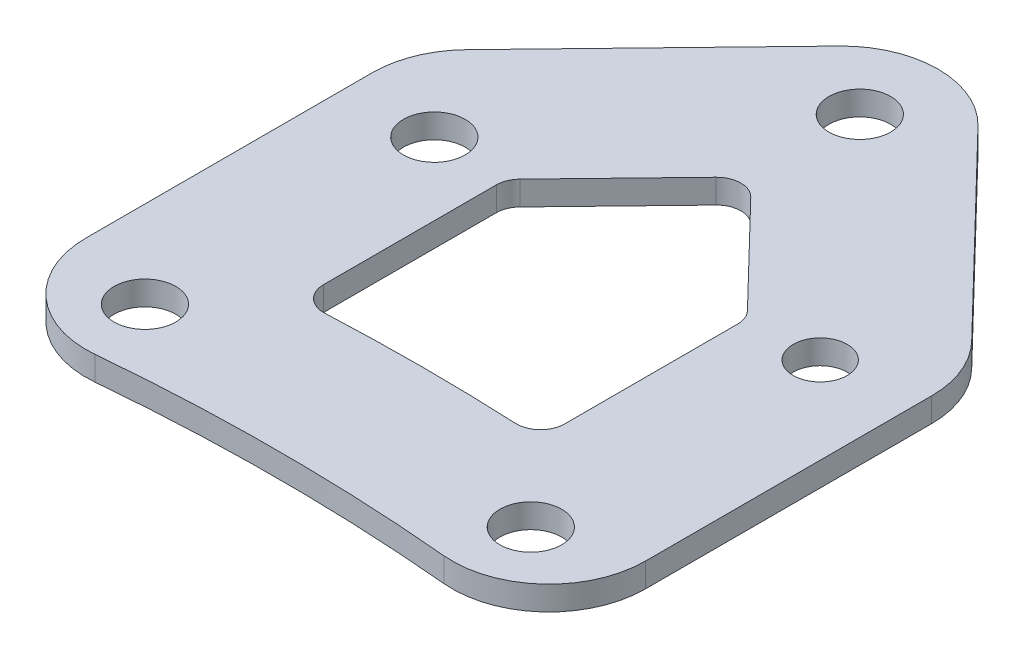
ISO-10303-21;
HEADER;
FILE_DESCRIPTION(('STEP AP214'),'2;1');
FILE_NAME('part.step','',(''),(''),'','','');
FILE_SCHEMA(('AUTOMOTIVE_DESIGN { 1 0 10303 214 1 1 1 1 }'));
ENDSEC;
DATA;
#1=APPLICATION_CONTEXT('core data for automotive mechanical design processes');
#2=APPLICATION_PROTOCOL_DEFINITION('international standard','automotive_design',2000,#1);
#3=PRODUCT_CONTEXT('',#1,'mechanical');
#4=PRODUCT('Part','Part','',(#3));
#5=PRODUCT_RELATED_PRODUCT_CATEGORY('part','',(#4));
#6=PRODUCT_DEFINITION_FORMATION('','',#4);
#7=PRODUCT_DEFINITION_CONTEXT('part definition',#1,'design');
#8=PRODUCT_DEFINITION('design','',#6,#7);
#9=PRODUCT_DEFINITION_SHAPE('','',#8);
#10=(LENGTH_UNIT() NAMED_UNIT(*) SI_UNIT(.MILLI.,.METRE.));
#11=(NAMED_UNIT(*) PLANE_ANGLE_UNIT() SI_UNIT($,.RADIAN.));
#12=(NAMED_UNIT(*) SI_UNIT($,.STERADIAN.) SOLID_ANGLE_UNIT());
#13=UNCERTAINTY_MEASURE_WITH_UNIT(LENGTH_MEASURE(1.E-05),#10,'distance_accuracy_value','');
#14=(GEOMETRIC_REPRESENTATION_CONTEXT(3) GLOBAL_UNCERTAINTY_ASSIGNED_CONTEXT((#13)) GLOBAL_UNIT_ASSIGNED_CONTEXT((#10,
#11,#12)) REPRESENTATION_CONTEXT('',''));
#15=CARTESIAN_POINT('',(0.,0.,0.));
#16=DIRECTION('',(0.,0.,1.));
#17=DIRECTION('',(1.,0.,0.));
#18=AXIS2_PLACEMENT_3D('',#15,#16,#17);
#19=CARTESIAN_POINT('',(-18.415,1.5875,19.05));
#20=DIRECTION('',(0.718988376049112,0.,0.695022096847475));
#21=DIRECTION('',(0.695022096847475,0.,-0.718988376049112));
#22=AXIS2_PLACEMENT_3D('',#19,#20,#21);
#23=PLANE('',#22);
#24=DIRECTION('',(-0.695022096847475,0.,0.718988376049112));
#25=VECTOR('',#24,1.);
#26=CARTESIAN_POINT('',(-18.415,0.,19.05));
#27=LINE('',#26,#25);
#28=CARTESIAN_POINT('',(-4.56557618791185,0.,4.72300984956399));
#29=VERTEX_POINT('',#28);
#30=CARTESIAN_POINT('',(-16.6305761879119,0.,17.2040443323226));
#31=VERTEX_POINT('',#30);
#32=EDGE_CURVE('E220',#29,#31,#27,.T.);
#33=ORIENTED_EDGE('',*,*,#32,.T.);
#34=DIRECTION('',(0.,-1.,0.));
#35=VECTOR('',#34,1.);
#36=CARTESIAN_POINT('',(-16.6305761879119,1.5875,17.2040443323226));
#37=LINE('',#36,#35);
#38=CARTESIAN_POINT('',(-16.6305761879119,1.5875,17.2040443323226));
#39=VERTEX_POINT('',#38);
#40=EDGE_CURVE('E279',#31,#39,#37,.F.);
#41=ORIENTED_EDGE('',*,*,#40,.T.);
#42=DIRECTION('',(-0.695022096847475,0.,0.718988376049112));
#43=VECTOR('',#42,1.);
#44=CARTESIAN_POINT('',(-18.415,1.5875,19.05));
#45=LINE('',#44,#43);
#46=CARTESIAN_POINT('',(-4.56557618791185,1.5875,4.72300984956399));
#47=VERTEX_POINT('',#46);
#48=EDGE_CURVE('E227',#47,#39,#45,.T.);
#49=ORIENTED_EDGE('',*,*,#48,.F.);
#50=DIRECTION('',(0.,-1.,0.));
#51=VECTOR('',#50,1.);
#52=CARTESIAN_POINT('',(-4.56557618791186,1.5875,4.72300984956399));
#53=LINE('',#52,#51);
#54=EDGE_CURVE('E275',#47,#29,#53,.T.);
#55=ORIENTED_EDGE('',*,*,#54,.T.);
#56=EDGE_LOOP('',(#33,#41,#49,#55));
#57=FACE_BOUND('',#56,.T.);
#58=ADVANCED_FACE('F45',(#57),#23,.F.);
#59=CARTESIAN_POINT('',(-18.415,1.5875,47.625));
#60=DIRECTION('',(1.,0.,0.));
#61=DIRECTION('',(0.,0.,-1.));
#62=AXIS2_PLACEMENT_3D('',#59,#60,#61);
#63=PLANE('',#62);
#64=DIRECTION('',(0.,0.,1.));
#65=VECTOR('',#64,1.);
#66=CARTESIAN_POINT('',(-18.415,0.,47.625));
#67=LINE('',#66,#65);
#68=CARTESIAN_POINT('',(-18.415,0.,21.6174346473041));
#69=VERTEX_POINT('',#68);
#70=CARTESIAN_POINT('',(-18.415,0.,40.4695418855872));
#71=VERTEX_POINT('',#70);
#72=EDGE_CURVE('E213',#69,#71,#67,.T.);
#73=ORIENTED_EDGE('',*,*,#72,.T.);
#74=DIRECTION('',(0.,-1.,0.));
#75=VECTOR('',#74,1.);
#76=CARTESIAN_POINT('',(-18.415,1.5875,40.4695418855872));
#77=LINE('',#76,#75);
#78=CARTESIAN_POINT('',(-18.415,1.5875,40.4695418855872));
#79=VERTEX_POINT('',#78);
#80=EDGE_CURVE('E188',#71,#79,#77,.F.);
#81=ORIENTED_EDGE('',*,*,#80,.T.);
#82=DIRECTION('',(0.,0.,1.));
#83=VECTOR('',#82,1.);
#84=CARTESIAN_POINT('',(-18.415,1.5875,47.625));
#85=LINE('',#84,#83);
#86=CARTESIAN_POINT('',(-18.415,1.5875,21.6174346473041));
#87=VERTEX_POINT('',#86);
#88=EDGE_CURVE('E436',#87,#79,#85,.T.);
#89=ORIENTED_EDGE('',*,*,#88,.F.);
#90=DIRECTION('',(0.,-1.,0.));
#91=VECTOR('',#90,1.);
#92=CARTESIAN_POINT('',(-18.415,1.5875,21.6174346473041));
#93=LINE('',#92,#91);
#94=EDGE_CURVE('E194',#87,#69,#93,.T.);
#95=ORIENTED_EDGE('',*,*,#94,.T.);
#96=EDGE_LOOP('',(#73,#81,#89,#95));
#97=FACE_BOUND('',#96,.T.);
#98=ADVANCED_FACE('F462',(#97),#63,.F.);
#99=CARTESIAN_POINT('',(0.,1.5875,171.73218846324));
#100=DIRECTION('',(0.,-1.,0.));
#101=DIRECTION('',(0.,0.,-1.));
#102=AXIS2_PLACEMENT_3D('',#99,#100,#101);
#103=CYLINDRICAL_SURFACE('',#102,125.465957348);
#104=CARTESIAN_POINT('',(0.,1.5875,171.73218846324));
#105=DIRECTION('',(0.,-1.,0.));
#106=DIRECTION('',(0.,0.,-1.));
#107=AXIS2_PLACEMENT_3D('',#104,#105,#106);
#108=CIRCLE('',#107,125.465957348);
#109=CARTESIAN_POINT('',(-11.4837900194986,1.5875,46.792887120395));
#110=VERTEX_POINT('',#109);
#111=CARTESIAN_POINT('',(11.4837900194986,1.5875,46.792887120395));
#112=VERTEX_POINT('',#111);
#113=EDGE_CURVE('E204',#110,#112,#108,.T.);
#114=ORIENTED_EDGE('',*,*,#113,.F.);
#115=DIRECTION('',(0.,-1.,0.));
#116=VECTOR('',#115,1.);
#117=CARTESIAN_POINT('',(-11.4837900194986,1.5875,46.792887120395));
#118=LINE('',#117,#116);
#119=CARTESIAN_POINT('',(-11.4837900194986,0.,46.792887120395));
#120=VERTEX_POINT('',#119);
#121=EDGE_CURVE('E187',#110,#120,#118,.T.);
#122=ORIENTED_EDGE('',*,*,#121,.T.);
#123=CARTESIAN_POINT('',(0.,0.,171.73218846324));
#124=DIRECTION('',(0.,-1.,0.));
#125=DIRECTION('',(0.,0.,-1.));
#126=AXIS2_PLACEMENT_3D('',#123,#124,#125);
#127=CIRCLE('',#126,125.465957348);
#128=CARTESIAN_POINT('',(11.4837900194986,0.,46.792887120395));
#129=VERTEX_POINT('',#128);
#130=EDGE_CURVE('E201',#120,#129,#127,.T.);
#131=ORIENTED_EDGE('',*,*,#130,.T.);
#132=DIRECTION('',(0.,-1.,0.));
#133=VECTOR('',#132,1.);
#134=CARTESIAN_POINT('',(11.4837900194986,1.5875,46.792887120395));
#135=LINE('',#134,#133);
#136=EDGE_CURVE('E207',#129,#112,#135,.F.);
#137=ORIENTED_EDGE('',*,*,#136,.T.);
#138=EDGE_LOOP('',(#114,#122,#131,#137));
#139=FACE_BOUND('',#138,.T.);
#140=ADVANCED_FACE('F200',(#139),#103,.F.);
#141=CARTESIAN_POINT('',(18.415,1.5875,19.05));
#142=DIRECTION('',(-1.,0.,0.));
#143=DIRECTION('',(0.,0.,1.));
#144=AXIS2_PLACEMENT_3D('',#141,#142,#143);
#145=PLANE('',#144);
#146=DIRECTION('',(0.,0.,-1.));
#147=VECTOR('',#146,1.);
#148=CARTESIAN_POINT('',(18.415,1.5875,19.05));
#149=LINE('',#148,#147);
#150=CARTESIAN_POINT('',(18.415,1.5875,40.4695418855872));
#151=VERTEX_POINT('',#150);
#152=CARTESIAN_POINT('',(18.415,1.5875,21.6174346473041));
#153=VERTEX_POINT('',#152);
#154=EDGE_CURVE('E442',#151,#153,#149,.T.);
#155=ORIENTED_EDGE('',*,*,#154,.F.);
#156=DIRECTION('',(0.,-1.,0.));
#157=VECTOR('',#156,1.);
#158=CARTESIAN_POINT('',(18.415,1.5875,40.4695418855872));
#159=LINE('',#158,#157);
#160=CARTESIAN_POINT('',(18.415,0.,40.4695418855872));
#161=VERTEX_POINT('',#160);
#162=EDGE_CURVE('E264',#151,#161,#159,.T.);
#163=ORIENTED_EDGE('',*,*,#162,.T.);
#164=DIRECTION('',(0.,0.,-1.));
#165=VECTOR('',#164,1.);
#166=CARTESIAN_POINT('',(18.415,0.,19.05));
#167=LINE('',#166,#165);
#168=CARTESIAN_POINT('',(18.415,0.,21.6174346473041));
#169=VERTEX_POINT('',#168);
#170=EDGE_CURVE('E212',#161,#169,#167,.T.);
#171=ORIENTED_EDGE('',*,*,#170,.T.);
#172=DIRECTION('',(0.,-1.,0.));
#173=VECTOR('',#172,1.);
#174=CARTESIAN_POINT('',(18.415,1.5875,21.6174346473041));
#175=LINE('',#174,#173);
#176=EDGE_CURVE('E261',#169,#153,#175,.F.);
#177=ORIENTED_EDGE('',*,*,#176,.T.);
#178=EDGE_LOOP('',(#155,#163,#171,#177));
#179=FACE_BOUND('',#178,.T.);
#180=ADVANCED_FACE('F469',(#179),#145,.F.);
#181=CARTESIAN_POINT('',(0.,1.5875,0.));
#182=DIRECTION('',(-0.718988376049112,0.,0.695022096847475));
#183=DIRECTION('',(0.695022096847475,0.,0.718988376049112));
#184=AXIS2_PLACEMENT_3D('',#181,#182,#183);
#185=PLANE('',#184);
#186=DIRECTION('',(-0.695022096847475,0.,-0.718988376049112));
#187=VECTOR('',#186,1.);
#188=CARTESIAN_POINT('',(0.,1.5875,0.));
#189=LINE('',#188,#187);
#190=CARTESIAN_POINT('',(16.6305761879119,1.5875,17.2040443323226));
#191=VERTEX_POINT('',#190);
#192=CARTESIAN_POINT('',(4.56557618791186,1.5875,4.72300984956399));
#193=VERTEX_POINT('',#192);
#194=EDGE_CURVE('E229',#191,#193,#189,.T.);
#195=ORIENTED_EDGE('',*,*,#194,.F.);
#196=DIRECTION('',(0.,-1.,0.));
#197=VECTOR('',#196,1.);
#198=CARTESIAN_POINT('',(16.6305761879119,1.5875,17.2040443323226));
#199=LINE('',#198,#197);
#200=CARTESIAN_POINT('',(16.6305761879119,0.,17.2040443323226));
#201=VERTEX_POINT('',#200);
#202=EDGE_CURVE('E271',#191,#201,#199,.T.);
#203=ORIENTED_EDGE('',*,*,#202,.T.);
#204=DIRECTION('',(-0.695022096847475,0.,-0.718988376049112));
#205=VECTOR('',#204,1.);
#206=CARTESIAN_POINT('',(0.,0.,0.));
#207=LINE('',#206,#205);
#208=CARTESIAN_POINT('',(4.56557618791186,0.,4.72300984956399));
#209=VERTEX_POINT('',#208);
#210=EDGE_CURVE('E218',#201,#209,#207,.T.);
#211=ORIENTED_EDGE('',*,*,#210,.T.);
#212=DIRECTION('',(0.,-1.,0.));
#213=VECTOR('',#212,1.);
#214=CARTESIAN_POINT('',(4.56557618791186,1.5875,4.723009849564));
#215=LINE('',#214,#213);
#216=EDGE_CURVE('E268',#209,#193,#215,.F.);
#217=ORIENTED_EDGE('',*,*,#216,.T.);
#218=EDGE_LOOP('',(#195,#203,#211,#217));
#219=FACE_BOUND('',#218,.T.);
#220=ADVANCED_FACE('F563',(#219),#185,.F.);
#221=CARTESIAN_POINT('',(0.,1.5875,171.73218846324));
#222=DIRECTION('',(0.,-1.,0.));
#223=DIRECTION('',(0.,0.,-1.));
#224=AXIS2_PLACEMENT_3D('',#221,#222,#223);
#225=PLANE('',#224);
#226=DIRECTION('',(0.,0.,1.));
#227=VECTOR('',#226,1.);
#228=CARTESIAN_POINT('',(-7.93750000000001,1.5875,23.2862671680517));
#229=LINE('',#228,#227);
#230=CARTESIAN_POINT('',(-7.93750000000001,1.5875,23.9281258298778));
#231=VERTEX_POINT('',#230);
#232=CARTESIAN_POINT('',(-7.93750000000006,1.5875,35.301427593268));
#233=VERTEX_POINT('',#232);
#234=EDGE_CURVE('E383',#231,#233,#229,.T.);
#235=ORIENTED_EDGE('',*,*,#234,.F.);
#236=CARTESIAN_POINT('',(-6.35000000000001,1.5875,23.9281258298778));
#237=DIRECTION('',(0.,-1.,0.));
#238=DIRECTION('',(0.,0.,-1.));
#239=AXIS2_PLACEMENT_3D('',#236,#237,#238);
#240=CIRCLE('',#239,1.5875);
#241=CARTESIAN_POINT('',(-7.49139404697798,1.5875,22.8247782511324));
#242=VERTEX_POINT('',#241);
#243=EDGE_CURVE('E334',#231,#242,#240,.T.);
#244=ORIENTED_EDGE('',*,*,#243,.T.);
#245=DIRECTION('',(-0.695022096847475,0.,0.718988376049112));
#246=VECTOR('',#245,1.);
#247=CARTESIAN_POINT('',(0.,1.5875,15.0750602715));
#248=LINE('',#247,#246);
#249=CARTESIAN_POINT('',(-1.14139404697797,1.5875,16.255812733891));
#250=VERTEX_POINT('',#249);
#251=EDGE_CURVE('E348',#250,#242,#248,.T.);
#252=ORIENTED_EDGE('',*,*,#251,.F.);
#253=CARTESIAN_POINT('',(0.,1.5875,17.3591603126364));
#254=DIRECTION('',(0.,-1.,0.));
#255=DIRECTION('',(0.,0.,-1.));
#256=AXIS2_PLACEMENT_3D('',#253,#254,#255);
#257=CIRCLE('',#256,1.5875);
#258=CARTESIAN_POINT('',(1.14139404697797,1.5875,16.255812733891));
#259=VERTEX_POINT('',#258);
#260=EDGE_CURVE('E54',#250,#259,#257,.T.);
#261=ORIENTED_EDGE('',*,*,#260,.T.);
#262=DIRECTION('',(-0.695022096847475,0.,-0.718988376049112));
#263=VECTOR('',#262,1.);
#264=CARTESIAN_POINT('',(7.9375,1.5875,23.2862671680517));
#265=LINE('',#264,#263);
#266=CARTESIAN_POINT('',(7.49139404697797,1.5875,22.8247782511324));
#267=VERTEX_POINT('',#266);
#268=EDGE_CURVE('E347',#267,#259,#265,.T.);
#269=ORIENTED_EDGE('',*,*,#268,.F.);
#270=CARTESIAN_POINT('',(6.35,1.5875,23.9281258298778));
#271=DIRECTION('',(0.,-1.,0.));
#272=DIRECTION('',(0.,0.,-1.));
#273=AXIS2_PLACEMENT_3D('',#270,#271,#272);
#274=CIRCLE('',#273,1.5875);
#275=CARTESIAN_POINT('',(7.9375,1.5875,23.9281258298778));
#276=VERTEX_POINT('',#275);
#277=EDGE_CURVE('E328',#267,#276,#274,.T.);
#278=ORIENTED_EDGE('',*,*,#277,.T.);
#279=DIRECTION('',(0.,0.,-1.));
#280=VECTOR('',#279,1.);
#281=CARTESIAN_POINT('',(7.9375,1.5875,36.9747966085459));
#282=LINE('',#281,#280);
#283=CARTESIAN_POINT('',(7.9375,1.5875,35.301427593268));
#284=VERTEX_POINT('',#283);
#285=EDGE_CURVE('E358',#284,#276,#282,.T.);
#286=ORIENTED_EDGE('',*,*,#285,.F.);
#287=CARTESIAN_POINT('',(6.35,1.5875,35.301427593268));
#288=DIRECTION('',(0.,-1.,0.));
#289=DIRECTION('',(0.,0.,-1.));
#290=AXIS2_PLACEMENT_3D('',#287,#288,#289);
#291=CIRCLE('',#290,1.5875);
#292=CARTESIAN_POINT('',(6.27619169087322,1.5875,36.8872108645582));
#293=VERTEX_POINT('',#292);
#294=EDGE_CURVE('E322',#284,#293,#291,.T.);
#295=ORIENTED_EDGE('',*,*,#294,.T.);
#296=CARTESIAN_POINT('',(0.,1.5875,171.73218846324));
#297=DIRECTION('',(0.,-1.,0.));
#298=DIRECTION('',(0.,0.,1.));
#299=AXIS2_PLACEMENT_3D('',#296,#297,#298);
#300=CIRCLE('',#299,134.990957348);
#301=CARTESIAN_POINT('',(-6.27619169087328,1.5875,36.8872108645582));
#302=VERTEX_POINT('',#301);
#303=EDGE_CURVE('E387',#302,#293,#300,.T.);
#304=ORIENTED_EDGE('',*,*,#303,.F.);
#305=CARTESIAN_POINT('',(-6.35000000000006,1.5875,35.301427593268));
#306=DIRECTION('',(0.,-1.,0.));
#307=DIRECTION('',(0.,0.,-1.));
#308=AXIS2_PLACEMENT_3D('',#305,#306,#307);
#309=CIRCLE('',#308,1.5875);
#310=EDGE_CURVE('E316',#302,#233,#309,.T.);
#311=ORIENTED_EDGE('',*,*,#310,.T.);
#312=EDGE_LOOP('',(#235,#244,#252,#261,#269,#278,#286,#295,#304,#311));
#313=FACE_BOUND('',#312,.T.);
#314=CARTESIAN_POINT('',(0.,1.5875,7.9375));
#315=DIRECTION('',(0.,1.,0.));
#316=DIRECTION('',(0.,0.,1.));
#317=AXIS2_PLACEMENT_3D('',#314,#315,#316);
#318=CIRCLE('',#317,2.032);
#319=CARTESIAN_POINT('',(0.,1.5875,9.9695));
#320=VERTEX_POINT('',#319);
#321=EDGE_CURVE('E419',#320,#320,#318,.T.);
#322=ORIENTED_EDGE('',*,*,#321,.F.);
#323=EDGE_LOOP('',(#322));
#324=FACE_BOUND('',#323,.T.);
#325=CARTESIAN_POINT('',(12.6999999999999,1.5875,23.244109533876));
#326=DIRECTION('',(0.,1.,0.));
#327=DIRECTION('',(0.,0.,1.));
#328=AXIS2_PLACEMENT_3D('',#325,#326,#327);
#329=CIRCLE('',#328,1.778);
#330=CARTESIAN_POINT('',(12.6999999999999,1.5875,25.022109533876));
#331=VERTEX_POINT('',#330);
#332=EDGE_CURVE('E411',#331,#331,#329,.T.);
#333=ORIENTED_EDGE('',*,*,#332,.F.);
#334=EDGE_LOOP('',(#333));
#335=FACE_BOUND('',#334,.T.);
#336=CARTESIAN_POINT('',(-12.7000000000001,1.5875,23.244109533876));
#337=DIRECTION('',(0.,1.,0.));
#338=DIRECTION('',(0.,0.,1.));
#339=AXIS2_PLACEMENT_3D('',#336,#337,#338);
#340=CIRCLE('',#339,2.032);
#341=CARTESIAN_POINT('',(-12.7000000000001,1.5875,25.276109533876));
#342=VERTEX_POINT('',#341);
#343=EDGE_CURVE('E403',#342,#342,#340,.T.);
#344=ORIENTED_EDGE('',*,*,#343,.F.);
#345=EDGE_LOOP('',(#344));
#346=FACE_BOUND('',#345,.T.);
#347=CARTESIAN_POINT('',(-12.7000000000001,1.5875,42.294109533876));
#348=DIRECTION('',(0.,1.,0.));
#349=DIRECTION('',(0.,0.,1.));
#350=AXIS2_PLACEMENT_3D('',#347,#348,#349);
#351=CIRCLE('',#350,2.032);
#352=CARTESIAN_POINT('',(-12.7000000000001,1.5875,44.326109533876));
#353=VERTEX_POINT('',#352);
#354=EDGE_CURVE('E394',#353,#353,#351,.T.);
#355=ORIENTED_EDGE('',*,*,#354,.F.);
#356=EDGE_LOOP('',(#355));
#357=FACE_BOUND('',#356,.T.);
#358=CARTESIAN_POINT('',(12.6999999999999,1.5875,42.294109533876));
#359=DIRECTION('',(0.,1.,0.));
#360=DIRECTION('',(0.,0.,1.));
#361=AXIS2_PLACEMENT_3D('',#358,#359,#360);
#362=CIRCLE('',#361,2.032);
#363=CARTESIAN_POINT('',(12.6999999999999,1.5875,44.326109533876));
#364=VERTEX_POINT('',#363);
#365=EDGE_CURVE('E398',#364,#364,#362,.T.);
#366=ORIENTED_EDGE('',*,*,#365,.F.);
#367=EDGE_LOOP('',(#366));
#368=FACE_BOUND('',#367,.T.);
#369=ORIENTED_EDGE('',*,*,#88,.T.);
#370=CARTESIAN_POINT('',(-12.065,1.5875,40.4695418855872));
#371=DIRECTION('',(0.,-1.,0.));
#372=DIRECTION('',(0.,0.,-1.));
#373=AXIS2_PLACEMENT_3D('',#370,#371,#372);
#374=CIRCLE('',#373,6.35);
#375=EDGE_CURVE('E258',#79,#110,#374,.F.);
#376=ORIENTED_EDGE('',*,*,#375,.T.);
#377=ORIENTED_EDGE('',*,*,#113,.T.);
#378=CARTESIAN_POINT('',(12.065,1.5875,40.4695418855872));
#379=DIRECTION('',(0.,-1.,0.));
#380=DIRECTION('',(0.,0.,-1.));
#381=AXIS2_PLACEMENT_3D('',#378,#379,#380);
#382=CIRCLE('',#381,6.35);
#383=EDGE_CURVE('E255',#112,#151,#382,.F.);
#384=ORIENTED_EDGE('',*,*,#383,.T.);
#385=ORIENTED_EDGE('',*,*,#154,.T.);
#386=CARTESIAN_POINT('',(12.065,1.5875,21.6174346473041));
#387=DIRECTION('',(0.,-1.,0.));
#388=DIRECTION('',(0.,0.,-1.));
#389=AXIS2_PLACEMENT_3D('',#386,#387,#388);
#390=CIRCLE('',#389,6.35);
#391=EDGE_CURVE('E252',#153,#191,#390,.F.);
#392=ORIENTED_EDGE('',*,*,#391,.T.);
#393=ORIENTED_EDGE('',*,*,#194,.T.);
#394=CARTESIAN_POINT('',(0.,1.5875,9.13640016454546));
#395=DIRECTION('',(0.,-1.,0.));
#396=DIRECTION('',(0.,0.,-1.));
#397=AXIS2_PLACEMENT_3D('',#394,#395,#396);
#398=CIRCLE('',#397,6.35);
#399=EDGE_CURVE('E246',#193,#47,#398,.F.);
#400=ORIENTED_EDGE('',*,*,#399,.T.);
#401=ORIENTED_EDGE('',*,*,#48,.T.);
#402=CARTESIAN_POINT('',(-12.065,1.5875,21.6174346473041));
#403=DIRECTION('',(0.,-1.,0.));
#404=DIRECTION('',(0.,0.,-1.));
#405=AXIS2_PLACEMENT_3D('',#402,#403,#404);
#406=CIRCLE('',#405,6.35);
#407=EDGE_CURVE('E249',#39,#87,#406,.F.);
#408=ORIENTED_EDGE('',*,*,#407,.T.);
#409=EDGE_LOOP('',(#369,#376,#377,#384,#385,#392,#393,#400,#401,#408));
#410=FACE_BOUND('',#409,.T.);
#411=ADVANCED_FACE('F345',(#313,#324,#335,#346,#357,#368,#410),#225,.F.);
#412=CARTESIAN_POINT('',(0.,0.,171.73218846324));
#413=DIRECTION('',(0.,-1.,0.));
#414=DIRECTION('',(0.,0.,-1.));
#415=AXIS2_PLACEMENT_3D('',#412,#413,#414);
#416=PLANE('',#415);
#417=DIRECTION('',(-0.695022096847475,0.,-0.718988376049112));
#418=VECTOR('',#417,1.);
#419=CARTESIAN_POINT('',(7.9375,0.,23.2862671680517));
#420=LINE('',#419,#418);
#421=CARTESIAN_POINT('',(7.49139404697797,0.,22.8247782511324));
#422=VERTEX_POINT('',#421);
#423=CARTESIAN_POINT('',(1.14139404697797,0.,16.255812733891));
#424=VERTEX_POINT('',#423);
#425=EDGE_CURVE('E377',#422,#424,#420,.T.);
#426=ORIENTED_EDGE('',*,*,#425,.T.);
#427=CARTESIAN_POINT('',(0.,0.,17.3591603126364));
#428=DIRECTION('',(0.,-1.,0.));
#429=DIRECTION('',(0.,0.,-1.));
#430=AXIS2_PLACEMENT_3D('',#427,#428,#429);
#431=CIRCLE('',#430,1.5875);
#432=CARTESIAN_POINT('',(-1.14139404697797,0.,16.255812733891));
#433=VERTEX_POINT('',#432);
#434=EDGE_CURVE('E11',#424,#433,#431,.F.);
#435=ORIENTED_EDGE('',*,*,#434,.T.);
#436=DIRECTION('',(-0.695022096847475,0.,0.718988376049112));
#437=VECTOR('',#436,1.);
#438=CARTESIAN_POINT('',(0.,0.,15.0750602715));
#439=LINE('',#438,#437);
#440=CARTESIAN_POINT('',(-7.49139404697798,0.,22.8247782511324));
#441=VERTEX_POINT('',#440);
#442=EDGE_CURVE('E357',#433,#441,#439,.T.);
#443=ORIENTED_EDGE('',*,*,#442,.T.);
#444=CARTESIAN_POINT('',(-6.35000000000001,0.,23.9281258298778));
#445=DIRECTION('',(0.,-1.,0.));
#446=DIRECTION('',(0.,0.,-1.));
#447=AXIS2_PLACEMENT_3D('',#444,#445,#446);
#448=CIRCLE('',#447,1.5875);
#449=CARTESIAN_POINT('',(-7.93750000000001,0.,23.9281258298778));
#450=VERTEX_POINT('',#449);
#451=EDGE_CURVE('E337',#441,#450,#448,.F.);
#452=ORIENTED_EDGE('',*,*,#451,.T.);
#453=DIRECTION('',(0.,0.,1.));
#454=VECTOR('',#453,1.);
#455=CARTESIAN_POINT('',(-7.93750000000001,0.,23.2862671680517));
#456=LINE('',#455,#454);
#457=CARTESIAN_POINT('',(-7.93750000000006,0.,35.301427593268));
#458=VERTEX_POINT('',#457);
#459=EDGE_CURVE('E363',#450,#458,#456,.T.);
#460=ORIENTED_EDGE('',*,*,#459,.T.);
#461=CARTESIAN_POINT('',(-6.35000000000006,0.,35.301427593268));
#462=DIRECTION('',(0.,-1.,0.));
#463=DIRECTION('',(0.,0.,-1.));
#464=AXIS2_PLACEMENT_3D('',#461,#462,#463);
#465=CIRCLE('',#464,1.5875);
#466=CARTESIAN_POINT('',(-6.27619169087328,0.,36.8872108645582));
#467=VERTEX_POINT('',#466);
#468=EDGE_CURVE('E319',#458,#467,#465,.F.);
#469=ORIENTED_EDGE('',*,*,#468,.T.);
#470=CARTESIAN_POINT('',(0.,0.,171.73218846324));
#471=DIRECTION('',(0.,-1.,0.));
#472=DIRECTION('',(0.,0.,1.));
#473=AXIS2_PLACEMENT_3D('',#470,#471,#472);
#474=CIRCLE('',#473,134.990957348);
#475=CARTESIAN_POINT('',(6.27619169087322,0.,36.8872108645582));
#476=VERTEX_POINT('',#475);
#477=EDGE_CURVE('E367',#467,#476,#474,.T.);
#478=ORIENTED_EDGE('',*,*,#477,.T.);
#479=CARTESIAN_POINT('',(6.35,0.,35.301427593268));
#480=DIRECTION('',(0.,-1.,0.));
#481=DIRECTION('',(0.,0.,-1.));
#482=AXIS2_PLACEMENT_3D('',#479,#480,#481);
#483=CIRCLE('',#482,1.5875);
#484=CARTESIAN_POINT('',(7.9375,0.,35.301427593268));
#485=VERTEX_POINT('',#484);
#486=EDGE_CURVE('E325',#476,#485,#483,.F.);
#487=ORIENTED_EDGE('',*,*,#486,.T.);
#488=DIRECTION('',(0.,0.,-1.));
#489=VECTOR('',#488,1.);
#490=CARTESIAN_POINT('',(7.9375,0.,36.9747966085459));
#491=LINE('',#490,#489);
#492=CARTESIAN_POINT('',(7.9375,0.,23.9281258298778));
#493=VERTEX_POINT('',#492);
#494=EDGE_CURVE('E373',#485,#493,#491,.T.);
#495=ORIENTED_EDGE('',*,*,#494,.T.);
#496=CARTESIAN_POINT('',(6.35,0.,23.9281258298778));
#497=DIRECTION('',(0.,-1.,0.));
#498=DIRECTION('',(0.,0.,-1.));
#499=AXIS2_PLACEMENT_3D('',#496,#497,#498);
#500=CIRCLE('',#499,1.5875);
#501=EDGE_CURVE('E331',#493,#422,#500,.F.);
#502=ORIENTED_EDGE('',*,*,#501,.T.);
#503=EDGE_LOOP('',(#426,#435,#443,#452,#460,#469,#478,#487,#495,#502));
#504=FACE_BOUND('',#503,.T.);
#505=CARTESIAN_POINT('',(0.,0.,7.9375));
#506=DIRECTION('',(0.,1.,0.));
#507=DIRECTION('',(0.,0.,1.));
#508=AXIS2_PLACEMENT_3D('',#505,#506,#507);
#509=CIRCLE('',#508,2.032);
#510=CARTESIAN_POINT('',(0.,0.,9.9695));
#511=VERTEX_POINT('',#510);
#512=EDGE_CURVE('E380',#511,#511,#509,.T.);
#513=ORIENTED_EDGE('',*,*,#512,.T.);
#514=EDGE_LOOP('',(#513));
#515=FACE_BOUND('',#514,.T.);
#516=CARTESIAN_POINT('',(12.6999999999999,0.,23.244109533876));
#517=DIRECTION('',(0.,1.,0.));
#518=DIRECTION('',(0.,0.,1.));
#519=AXIS2_PLACEMENT_3D('',#516,#517,#518);
#520=CIRCLE('',#519,1.778);
#521=CARTESIAN_POINT('',(12.6999999999999,0.,25.022109533876));
#522=VERTEX_POINT('',#521);
#523=EDGE_CURVE('E415',#522,#522,#520,.T.);
#524=ORIENTED_EDGE('',*,*,#523,.T.);
#525=EDGE_LOOP('',(#524));
#526=FACE_BOUND('',#525,.T.);
#527=CARTESIAN_POINT('',(-12.7000000000001,0.,23.244109533876));
#528=DIRECTION('',(0.,1.,0.));
#529=DIRECTION('',(0.,0.,1.));
#530=AXIS2_PLACEMENT_3D('',#527,#528,#529);
#531=CIRCLE('',#530,2.032);
#532=CARTESIAN_POINT('',(-12.7000000000001,0.,25.276109533876));
#533=VERTEX_POINT('',#532);
#534=EDGE_CURVE('E407',#533,#533,#531,.T.);
#535=ORIENTED_EDGE('',*,*,#534,.T.);
#536=EDGE_LOOP('',(#535));
#537=FACE_BOUND('',#536,.T.);
#538=CARTESIAN_POINT('',(-12.7000000000001,0.,42.294109533876));
#539=DIRECTION('',(0.,1.,0.));
#540=DIRECTION('',(0.,0.,1.));
#541=AXIS2_PLACEMENT_3D('',#538,#539,#540);
#542=CIRCLE('',#541,2.032);
#543=CARTESIAN_POINT('',(-12.7000000000001,0.,44.326109533876));
#544=VERTEX_POINT('',#543);
#545=EDGE_CURVE('E399',#544,#544,#542,.T.);
#546=ORIENTED_EDGE('',*,*,#545,.T.);
#547=EDGE_LOOP('',(#546));
#548=FACE_BOUND('',#547,.T.);
#549=CARTESIAN_POINT('',(12.6999999999999,0.,42.294109533876));
#550=DIRECTION('',(0.,1.,0.));
#551=DIRECTION('',(0.,0.,1.));
#552=AXIS2_PLACEMENT_3D('',#549,#550,#551);
#553=CIRCLE('',#552,2.032);
#554=CARTESIAN_POINT('',(12.6999999999999,0.,44.326109533876));
#555=VERTEX_POINT('',#554);
#556=EDGE_CURVE('E426',#555,#555,#553,.T.);
#557=ORIENTED_EDGE('',*,*,#556,.T.);
#558=EDGE_LOOP('',(#557));
#559=FACE_BOUND('',#558,.T.);
#560=ORIENTED_EDGE('',*,*,#130,.F.);
#561=CARTESIAN_POINT('',(-12.065,0.,40.4695418855872));
#562=DIRECTION('',(0.,-1.,0.));
#563=DIRECTION('',(0.,0.,-1.));
#564=AXIS2_PLACEMENT_3D('',#561,#562,#563);
#565=CIRCLE('',#564,6.35);
#566=EDGE_CURVE('E183',#120,#71,#565,.T.);
#567=ORIENTED_EDGE('',*,*,#566,.T.);
#568=ORIENTED_EDGE('',*,*,#72,.F.);
#569=CARTESIAN_POINT('',(-12.065,0.,21.6174346473041));
#570=DIRECTION('',(0.,-1.,0.));
#571=DIRECTION('',(0.,0.,-1.));
#572=AXIS2_PLACEMENT_3D('',#569,#570,#571);
#573=CIRCLE('',#572,6.35);
#574=EDGE_CURVE('E233',#69,#31,#573,.T.);
#575=ORIENTED_EDGE('',*,*,#574,.T.);
#576=ORIENTED_EDGE('',*,*,#32,.F.);
#577=CARTESIAN_POINT('',(0.,0.,9.13640016454546));
#578=DIRECTION('',(0.,-1.,0.));
#579=DIRECTION('',(0.,0.,-1.));
#580=AXIS2_PLACEMENT_3D('',#577,#578,#579);
#581=CIRCLE('',#580,6.35);
#582=EDGE_CURVE('E206',#29,#209,#581,.T.);
#583=ORIENTED_EDGE('',*,*,#582,.T.);
#584=ORIENTED_EDGE('',*,*,#210,.F.);
#585=CARTESIAN_POINT('',(12.065,0.,21.6174346473041));
#586=DIRECTION('',(0.,-1.,0.));
#587=DIRECTION('',(0.,0.,-1.));
#588=AXIS2_PLACEMENT_3D('',#585,#586,#587);
#589=CIRCLE('',#588,6.35);
#590=EDGE_CURVE('E236',#201,#169,#589,.T.);
#591=ORIENTED_EDGE('',*,*,#590,.T.);
#592=ORIENTED_EDGE('',*,*,#170,.F.);
#593=CARTESIAN_POINT('',(12.065,0.,40.4695418855872));
#594=DIRECTION('',(0.,-1.,0.));
#595=DIRECTION('',(0.,0.,-1.));
#596=AXIS2_PLACEMENT_3D('',#593,#594,#595);
#597=CIRCLE('',#596,6.35);
#598=EDGE_CURVE('E195',#161,#129,#597,.T.);
#599=ORIENTED_EDGE('',*,*,#598,.T.);
#600=EDGE_LOOP('',(#560,#567,#568,#575,#576,#583,#584,#591,#592,#599));
#601=FACE_BOUND('',#600,.T.);
#602=ADVANCED_FACE('F209',(#504,#515,#526,#537,#548,#559,#601),#416,.T.);
#603=CARTESIAN_POINT('',(12.6999999999999,0.,42.294109533876));
#604=DIRECTION('',(0.,1.,0.));
#605=DIRECTION('',(0.,0.,1.));
#606=AXIS2_PLACEMENT_3D('',#603,#604,#605);
#607=CYLINDRICAL_SURFACE('',#606,2.032);
#608=ORIENTED_EDGE('',*,*,#556,.F.);
#609=EDGE_LOOP('',(#608));
#610=FACE_BOUND('',#609,.T.);
#611=ORIENTED_EDGE('',*,*,#365,.T.);
#612=EDGE_LOOP('',(#611));
#613=FACE_BOUND('',#612,.T.);
#614=ADVANCED_FACE('F546',(#610,#613),#607,.F.);
#615=CARTESIAN_POINT('',(-12.7000000000001,0.,42.294109533876));
#616=DIRECTION('',(0.,1.,0.));
#617=DIRECTION('',(0.,0.,1.));
#618=AXIS2_PLACEMENT_3D('',#615,#616,#617);
#619=CYLINDRICAL_SURFACE('',#618,2.032);
#620=ORIENTED_EDGE('',*,*,#545,.F.);
#621=EDGE_LOOP('',(#620));
#622=FACE_BOUND('',#621,.T.);
#623=ORIENTED_EDGE('',*,*,#354,.T.);
#624=EDGE_LOOP('',(#623));
#625=FACE_BOUND('',#624,.T.);
#626=ADVANCED_FACE('F542',(#622,#625),#619,.F.);
#627=CARTESIAN_POINT('',(-12.7000000000001,0.,23.244109533876));
#628=DIRECTION('',(0.,1.,0.));
#629=DIRECTION('',(0.,0.,1.));
#630=AXIS2_PLACEMENT_3D('',#627,#628,#629);
#631=CYLINDRICAL_SURFACE('',#630,2.032);
#632=ORIENTED_EDGE('',*,*,#534,.F.);
#633=EDGE_LOOP('',(#632));
#634=FACE_BOUND('',#633,.T.);
#635=ORIENTED_EDGE('',*,*,#343,.T.);
#636=EDGE_LOOP('',(#635));
#637=FACE_BOUND('',#636,.T.);
#638=ADVANCED_FACE('F545',(#634,#637),#631,.F.);
#639=CARTESIAN_POINT('',(12.6999999999999,0.,23.244109533876));
#640=DIRECTION('',(0.,1.,0.));
#641=DIRECTION('',(0.,0.,1.));
#642=AXIS2_PLACEMENT_3D('',#639,#640,#641);
#643=CYLINDRICAL_SURFACE('',#642,1.778);
#644=ORIENTED_EDGE('',*,*,#523,.F.);
#645=EDGE_LOOP('',(#644));
#646=FACE_BOUND('',#645,.T.);
#647=ORIENTED_EDGE('',*,*,#332,.T.);
#648=EDGE_LOOP('',(#647));
#649=FACE_BOUND('',#648,.T.);
#650=ADVANCED_FACE('F550',(#646,#649),#643,.F.);
#651=CARTESIAN_POINT('',(0.,0.,7.9375));
#652=DIRECTION('',(0.,1.,0.));
#653=DIRECTION('',(0.,0.,1.));
#654=AXIS2_PLACEMENT_3D('',#651,#652,#653);
#655=CYLINDRICAL_SURFACE('',#654,2.032);
#656=ORIENTED_EDGE('',*,*,#512,.F.);
#657=EDGE_LOOP('',(#656));
#658=FACE_BOUND('',#657,.T.);
#659=ORIENTED_EDGE('',*,*,#321,.T.);
#660=EDGE_LOOP('',(#659));
#661=FACE_BOUND('',#660,.T.);
#662=ADVANCED_FACE('F541',(#658,#661),#655,.F.);
#663=CARTESIAN_POINT('',(0.,0.,15.0750602715));
#664=DIRECTION('',(-0.718988376049112,0.,-0.695022096847475));
#665=DIRECTION('',(-0.695022096847475,0.,0.718988376049112));
#666=AXIS2_PLACEMENT_3D('',#663,#664,#665);
#667=PLANE('',#666);
#668=ORIENTED_EDGE('',*,*,#251,.T.);
#669=DIRECTION('',(0.,1.,0.));
#670=VECTOR('',#669,1.);
#671=CARTESIAN_POINT('',(-7.49139404697798,0.,22.8247782511324));
#672=LINE('',#671,#670);
#673=EDGE_CURVE('E61',#242,#441,#672,.F.);
#674=ORIENTED_EDGE('',*,*,#673,.T.);
#675=ORIENTED_EDGE('',*,*,#442,.F.);
#676=DIRECTION('',(0.,1.,0.));
#677=VECTOR('',#676,1.);
#678=CARTESIAN_POINT('',(-1.14139404697796,1.5875,16.255812733891));
#679=LINE('',#678,#677);
#680=EDGE_CURVE('E310',#433,#250,#679,.T.);
#681=ORIENTED_EDGE('',*,*,#680,.T.);
#682=EDGE_LOOP('',(#668,#674,#675,#681));
#683=FACE_BOUND('',#682,.T.);
#684=ADVANCED_FACE('F360',(#683),#667,.F.);
#685=CARTESIAN_POINT('',(7.9375,0.,23.2862671680517));
#686=DIRECTION('',(0.718988376049112,0.,-0.695022096847475));
#687=DIRECTION('',(-0.695022096847475,0.,-0.718988376049112));
#688=AXIS2_PLACEMENT_3D('',#685,#686,#687);
#689=PLANE('',#688);
#690=ORIENTED_EDGE('',*,*,#425,.F.);
#691=DIRECTION('',(0.,1.,0.));
#692=VECTOR('',#691,1.);
#693=CARTESIAN_POINT('',(7.49139404697797,1.5875,22.8247782511324));
#694=LINE('',#693,#692);
#695=EDGE_CURVE('E306',#422,#267,#694,.T.);
#696=ORIENTED_EDGE('',*,*,#695,.T.);
#697=ORIENTED_EDGE('',*,*,#268,.T.);
#698=DIRECTION('',(0.,1.,0.));
#699=VECTOR('',#698,1.);
#700=CARTESIAN_POINT('',(1.14139404697797,0.,16.255812733891));
#701=LINE('',#700,#699);
#702=EDGE_CURVE('E303',#259,#424,#701,.F.);
#703=ORIENTED_EDGE('',*,*,#702,.T.);
#704=EDGE_LOOP('',(#690,#696,#697,#703));
#705=FACE_BOUND('',#704,.T.);
#706=ADVANCED_FACE('F354',(#705),#689,.F.);
#707=CARTESIAN_POINT('',(7.9375,0.,36.9747966085459));
#708=DIRECTION('',(1.,0.,0.));
#709=DIRECTION('',(0.,0.,-1.));
#710=AXIS2_PLACEMENT_3D('',#707,#708,#709);
#711=PLANE('',#710);
#712=ORIENTED_EDGE('',*,*,#494,.F.);
#713=DIRECTION('',(0.,-1.,0.));
#714=VECTOR('',#713,1.);
#715=CARTESIAN_POINT('',(7.9375,1.5875,35.301427593268));
#716=LINE('',#715,#714);
#717=EDGE_CURVE('E299',#485,#284,#716,.F.);
#718=ORIENTED_EDGE('',*,*,#717,.T.);
#719=ORIENTED_EDGE('',*,*,#285,.T.);
#720=DIRECTION('',(0.,1.,0.));
#721=VECTOR('',#720,1.);
#722=CARTESIAN_POINT('',(7.9375,0.,23.9281258298778));
#723=LINE('',#722,#721);
#724=EDGE_CURVE('E296',#276,#493,#723,.F.);
#725=ORIENTED_EDGE('',*,*,#724,.T.);
#726=EDGE_LOOP('',(#712,#718,#719,#725));
#727=FACE_BOUND('',#726,.T.);
#728=ADVANCED_FACE('F525',(#727),#711,.F.);
#729=CARTESIAN_POINT('',(0.,0.,171.73218846324));
#730=DIRECTION('',(0.,1.,0.));
#731=DIRECTION('',(0.,0.,1.));
#732=AXIS2_PLACEMENT_3D('',#729,#730,#731);
#733=CYLINDRICAL_SURFACE('',#732,134.990957348);
#734=ORIENTED_EDGE('',*,*,#477,.F.);
#735=DIRECTION('',(0.,1.,0.));
#736=VECTOR('',#735,1.);
#737=CARTESIAN_POINT('',(-6.27619169087328,0.,36.8872108645582));
#738=LINE('',#737,#736);
#739=EDGE_CURVE('E285',#467,#302,#738,.T.);
#740=ORIENTED_EDGE('',*,*,#739,.T.);
#741=ORIENTED_EDGE('',*,*,#303,.T.);
#742=DIRECTION('',(0.,1.,0.));
#743=VECTOR('',#742,1.);
#744=CARTESIAN_POINT('',(6.27619169087322,0.,36.8872108645582));
#745=LINE('',#744,#743);
#746=EDGE_CURVE('E282',#293,#476,#745,.F.);
#747=ORIENTED_EDGE('',*,*,#746,.T.);
#748=EDGE_LOOP('',(#734,#740,#741,#747));
#749=FACE_BOUND('',#748,.T.);
#750=ADVANCED_FACE('F518',(#749),#733,.T.);
#751=CARTESIAN_POINT('',(-7.93750000000001,0.,23.2862671680517));
#752=DIRECTION('',(-1.,0.,0.));
#753=DIRECTION('',(0.,0.,1.));
#754=AXIS2_PLACEMENT_3D('',#751,#752,#753);
#755=PLANE('',#754);
#756=ORIENTED_EDGE('',*,*,#234,.T.);
#757=DIRECTION('',(0.,-1.,0.));
#758=VECTOR('',#757,1.);
#759=CARTESIAN_POINT('',(-7.93750000000006,0.,35.301427593268));
#760=LINE('',#759,#758);
#761=EDGE_CURVE('E293',#233,#458,#760,.T.);
#762=ORIENTED_EDGE('',*,*,#761,.T.);
#763=ORIENTED_EDGE('',*,*,#459,.F.);
#764=DIRECTION('',(0.,1.,0.));
#765=VECTOR('',#764,1.);
#766=CARTESIAN_POINT('',(-7.93750000000001,1.5875,23.9281258298778));
#767=LINE('',#766,#765);
#768=EDGE_CURVE('E289',#450,#231,#767,.T.);
#769=ORIENTED_EDGE('',*,*,#768,.T.);
#770=EDGE_LOOP('',(#756,#762,#763,#769));
#771=FACE_BOUND('',#770,.T.);
#772=ADVANCED_FACE('F477',(#771),#755,.F.);
#773=CARTESIAN_POINT('',(-12.065,1.5875,40.4695418855872));
#774=DIRECTION('',(0.,-1.,0.));
#775=DIRECTION('',(0.,0.,-1.));
#776=AXIS2_PLACEMENT_3D('',#773,#774,#775);
#777=CYLINDRICAL_SURFACE('',#776,6.35);
#778=ORIENTED_EDGE('',*,*,#375,.F.);
#779=ORIENTED_EDGE('',*,*,#80,.F.);
#780=ORIENTED_EDGE('',*,*,#566,.F.);
#781=ORIENTED_EDGE('',*,*,#121,.F.);
#782=EDGE_LOOP('',(#778,#779,#780,#781));
#783=FACE_BOUND('',#782,.T.);
#784=ADVANCED_FACE('F186',(#783),#777,.T.);
#785=CARTESIAN_POINT('',(12.065,1.5875,40.4695418855872));
#786=DIRECTION('',(0.,-1.,0.));
#787=DIRECTION('',(0.,0.,-1.));
#788=AXIS2_PLACEMENT_3D('',#785,#786,#787);
#789=CYLINDRICAL_SURFACE('',#788,6.35);
#790=ORIENTED_EDGE('',*,*,#383,.F.);
#791=ORIENTED_EDGE('',*,*,#136,.F.);
#792=ORIENTED_EDGE('',*,*,#598,.F.);
#793=ORIENTED_EDGE('',*,*,#162,.F.);
#794=EDGE_LOOP('',(#790,#791,#792,#793));
#795=FACE_BOUND('',#794,.T.);
#796=ADVANCED_FACE('F476',(#795),#789,.T.);
#797=CARTESIAN_POINT('',(12.065,1.5875,21.6174346473041));
#798=DIRECTION('',(0.,-1.,0.));
#799=DIRECTION('',(0.,0.,-1.));
#800=AXIS2_PLACEMENT_3D('',#797,#798,#799);
#801=CYLINDRICAL_SURFACE('',#800,6.35);
#802=ORIENTED_EDGE('',*,*,#391,.F.);
#803=ORIENTED_EDGE('',*,*,#176,.F.);
#804=ORIENTED_EDGE('',*,*,#590,.F.);
#805=ORIENTED_EDGE('',*,*,#202,.F.);
#806=EDGE_LOOP('',(#802,#803,#804,#805));
#807=FACE_BOUND('',#806,.T.);
#808=ADVANCED_FACE('F480',(#807),#801,.T.);
#809=CARTESIAN_POINT('',(-12.065,1.5875,21.6174346473041));
#810=DIRECTION('',(0.,-1.,0.));
#811=DIRECTION('',(0.,0.,-1.));
#812=AXIS2_PLACEMENT_3D('',#809,#810,#811);
#813=CYLINDRICAL_SURFACE('',#812,6.35);
#814=ORIENTED_EDGE('',*,*,#407,.F.);
#815=ORIENTED_EDGE('',*,*,#40,.F.);
#816=ORIENTED_EDGE('',*,*,#574,.F.);
#817=ORIENTED_EDGE('',*,*,#94,.F.);
#818=EDGE_LOOP('',(#814,#815,#816,#817));
#819=FACE_BOUND('',#818,.T.);
#820=ADVANCED_FACE('F457',(#819),#813,.T.);
#821=CARTESIAN_POINT('',(0.,1.5875,9.13640016454546));
#822=DIRECTION('',(0.,-1.,0.));
#823=DIRECTION('',(0.,0.,-1.));
#824=AXIS2_PLACEMENT_3D('',#821,#822,#823);
#825=CYLINDRICAL_SURFACE('',#824,6.35);
#826=ORIENTED_EDGE('',*,*,#399,.F.);
#827=ORIENTED_EDGE('',*,*,#216,.F.);
#828=ORIENTED_EDGE('',*,*,#582,.F.);
#829=ORIENTED_EDGE('',*,*,#54,.F.);
#830=EDGE_LOOP('',(#826,#827,#828,#829));
#831=FACE_BOUND('',#830,.T.);
#832=ADVANCED_FACE('F487',(#831),#825,.T.);
#833=CARTESIAN_POINT('',(-6.35000000000006,0.,35.301427593268));
#834=DIRECTION('',(0.,1.,0.));
#835=DIRECTION('',(0.,0.,1.));
#836=AXIS2_PLACEMENT_3D('',#833,#834,#835);
#837=CYLINDRICAL_SURFACE('',#836,1.5875);
#838=ORIENTED_EDGE('',*,*,#468,.F.);
#839=ORIENTED_EDGE('',*,*,#761,.F.);
#840=ORIENTED_EDGE('',*,*,#310,.F.);
#841=ORIENTED_EDGE('',*,*,#739,.F.);
#842=EDGE_LOOP('',(#838,#839,#840,#841));
#843=FACE_BOUND('',#842,.T.);
#844=ADVANCED_FACE('F490',(#843),#837,.F.);
#845=CARTESIAN_POINT('',(6.35,0.,35.301427593268));
#846=DIRECTION('',(0.,1.,0.));
#847=DIRECTION('',(0.,0.,1.));
#848=AXIS2_PLACEMENT_3D('',#845,#846,#847);
#849=CYLINDRICAL_SURFACE('',#848,1.5875);
#850=ORIENTED_EDGE('',*,*,#486,.F.);
#851=ORIENTED_EDGE('',*,*,#746,.F.);
#852=ORIENTED_EDGE('',*,*,#294,.F.);
#853=ORIENTED_EDGE('',*,*,#717,.F.);
#854=EDGE_LOOP('',(#850,#851,#852,#853));
#855=FACE_BOUND('',#854,.T.);
#856=ADVANCED_FACE('F494',(#855),#849,.F.);
#857=CARTESIAN_POINT('',(6.35,0.,23.9281258298778));
#858=DIRECTION('',(0.,-1.,0.));
#859=DIRECTION('',(0.,0.,-1.));
#860=AXIS2_PLACEMENT_3D('',#857,#858,#859);
#861=CYLINDRICAL_SURFACE('',#860,1.5875);
#862=ORIENTED_EDGE('',*,*,#501,.F.);
#863=ORIENTED_EDGE('',*,*,#724,.F.);
#864=ORIENTED_EDGE('',*,*,#277,.F.);
#865=ORIENTED_EDGE('',*,*,#695,.F.);
#866=EDGE_LOOP('',(#862,#863,#864,#865));
#867=FACE_BOUND('',#866,.T.);
#868=ADVANCED_FACE('F498',(#867),#861,.F.);
#869=CARTESIAN_POINT('',(-6.35000000000001,0.,23.9281258298778));
#870=DIRECTION('',(0.,-1.,0.));
#871=DIRECTION('',(0.,0.,-1.));
#872=AXIS2_PLACEMENT_3D('',#869,#870,#871);
#873=CYLINDRICAL_SURFACE('',#872,1.5875);
#874=ORIENTED_EDGE('',*,*,#451,.F.);
#875=ORIENTED_EDGE('',*,*,#673,.F.);
#876=ORIENTED_EDGE('',*,*,#243,.F.);
#877=ORIENTED_EDGE('',*,*,#768,.F.);
#878=EDGE_LOOP('',(#874,#875,#876,#877));
#879=FACE_BOUND('',#878,.T.);
#880=ADVANCED_FACE('F501',(#879),#873,.F.);
#881=CARTESIAN_POINT('',(0.,0.,17.3591603126364));
#882=DIRECTION('',(0.,-1.,0.));
#883=DIRECTION('',(0.,0.,-1.));
#884=AXIS2_PLACEMENT_3D('',#881,#882,#883);
#885=CYLINDRICAL_SURFACE('',#884,1.5875);
#886=ORIENTED_EDGE('',*,*,#434,.F.);
#887=ORIENTED_EDGE('',*,*,#702,.F.);
#888=ORIENTED_EDGE('',*,*,#260,.F.);
#889=ORIENTED_EDGE('',*,*,#680,.F.);
#890=EDGE_LOOP('',(#886,#887,#888,#889));
#891=FACE_BOUND('',#890,.T.);
#892=ADVANCED_FACE('F47',(#891),#885,.F.);
#893=CLOSED_SHELL('',(#58,#98,#140,#180,#220,#411,#602,#614,#626,#638,#650,#662,#684,#706,#728,
#750,#772,#784,#796,#808,#820,#832,#844,#856,#868,#880,#892));
#894=MANIFOLD_SOLID_BREP('B2',#893);
#895=ADVANCED_BREP_SHAPE_REPRESENTATION('',(#18,#894),#14);
#896=SHAPE_DEFINITION_REPRESENTATION(#9,#895);
ENDSEC;
END-ISO-10303-21;
